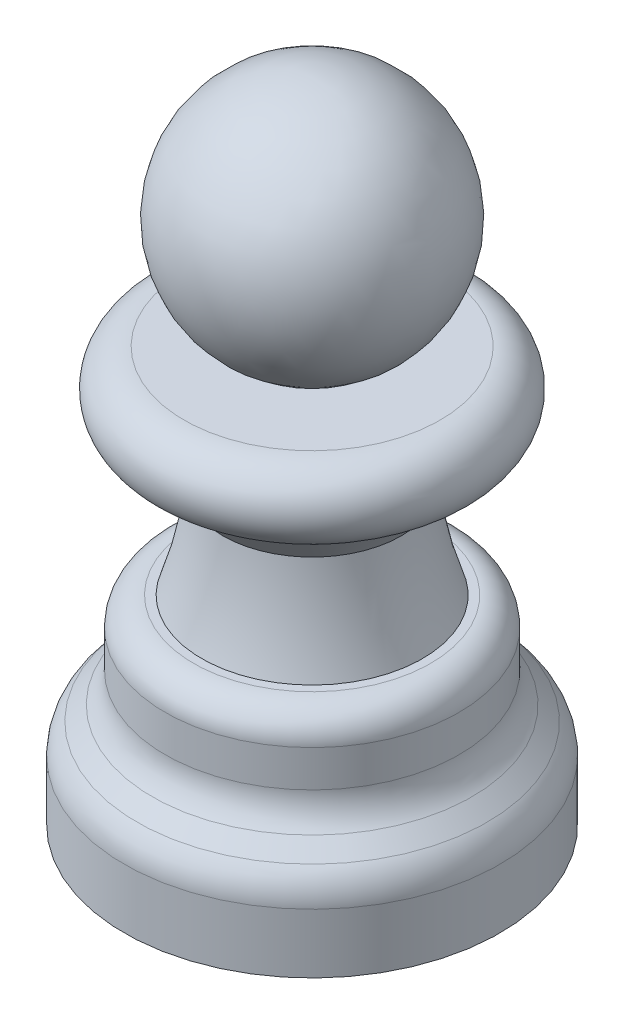
ISO-10303-21;
HEADER;
FILE_DESCRIPTION(('STEP AP214'),'2;1');
FILE_NAME('part.step','',(''),(''),'','','');
FILE_SCHEMA(('AUTOMOTIVE_DESIGN { 1 0 10303 214 1 1 1 1 }'));
ENDSEC;
DATA;
#1=APPLICATION_CONTEXT('core data for automotive mechanical design processes');
#2=APPLICATION_PROTOCOL_DEFINITION('international standard','automotive_design',2000,#1);
#3=PRODUCT_CONTEXT('',#1,'mechanical');
#4=PRODUCT('Part','Part','',(#3));
#5=PRODUCT_RELATED_PRODUCT_CATEGORY('part','',(#4));
#6=PRODUCT_DEFINITION_FORMATION('','',#4);
#7=PRODUCT_DEFINITION_CONTEXT('part definition',#1,'design');
#8=PRODUCT_DEFINITION('design','',#6,#7);
#9=PRODUCT_DEFINITION_SHAPE('','',#8);
#10=(LENGTH_UNIT() NAMED_UNIT(*) SI_UNIT(.MILLI.,.METRE.));
#11=(NAMED_UNIT(*) PLANE_ANGLE_UNIT() SI_UNIT($,.RADIAN.));
#12=(NAMED_UNIT(*) SI_UNIT($,.STERADIAN.) SOLID_ANGLE_UNIT());
#13=UNCERTAINTY_MEASURE_WITH_UNIT(LENGTH_MEASURE(1.E-05),#10,'distance_accuracy_value','');
#14=(GEOMETRIC_REPRESENTATION_CONTEXT(3) GLOBAL_UNCERTAINTY_ASSIGNED_CONTEXT((#13)) GLOBAL_UNIT_ASSIGNED_CONTEXT((#10,
#11,#12)) REPRESENTATION_CONTEXT('',''));
#15=CARTESIAN_POINT('',(0.,0.,0.));
#16=DIRECTION('',(0.,0.,1.));
#17=DIRECTION('',(1.,0.,0.));
#18=AXIS2_PLACEMENT_3D('',#15,#16,#17);
#19=CARTESIAN_POINT('',(0.,34.6588955443455,0.));
#20=DIRECTION('',(0.,-1.,0.));
#21=DIRECTION('',(0.,0.,-1.));
#22=AXIS2_PLACEMENT_3D('',#19,#20,#21);
#23=TOROIDAL_SURFACE('',#22,30.8078538333449,25.4);
#24=CARTESIAN_POINT('',(0.,32.2474807752198,0.));
#25=DIRECTION('',(0.,1.,0.));
#26=DIRECTION('',(0.,0.,1.));
#27=AXIS2_PLACEMENT_3D('',#24,#25,#26);
#28=CIRCLE('',#27,5.52257988167018);
#29=CARTESIAN_POINT('',(0.,32.2474807752198,5.52257988167018));
#30=VERTEX_POINT('',#29);
#31=EDGE_CURVE('E55',#30,#30,#28,.F.);
#32=ORIENTED_EDGE('',*,*,#31,.T.);
#33=EDGE_LOOP('',(#32));
#34=FACE_BOUND('',#33,.T.);
#35=CARTESIAN_POINT('',(0.,26.3191461497147,0.));
#36=DIRECTION('',(0.,-1.,0.));
#37=DIRECTION('',(0.,0.,-1.));
#38=AXIS2_PLACEMENT_3D('',#35,#36,#37);
#39=CIRCLE('',#38,6.81600980178382);
#40=CARTESIAN_POINT('',(0.,26.3191461497147,-6.81600980178382));
#41=VERTEX_POINT('',#40);
#42=EDGE_CURVE('E60',#41,#41,#39,.T.);
#43=ORIENTED_EDGE('',*,*,#42,.F.);
#44=EDGE_LOOP('',(#43));
#45=FACE_BOUND('',#44,.T.);
#46=ADVANCED_FACE('F46',(#34,#45),#23,.F.);
#47=CARTESIAN_POINT('',(-7.32281480130766,26.3191461497147,0.));
#48=DIRECTION('',(0.,-1.,0.));
#49=DIRECTION('',(0.,0.,-1.));
#50=AXIS2_PLACEMENT_3D('',#47,#48,#49);
#51=PLANE('',#50);
#52=CARTESIAN_POINT('',(0.,26.3191461497147,0.));
#53=DIRECTION('',(0.,-1.,0.));
#54=DIRECTION('',(0.,0.,-1.));
#55=AXIS2_PLACEMENT_3D('',#52,#53,#54);
#56=CIRCLE('',#55,7.32281480130766);
#57=CARTESIAN_POINT('',(0.,26.3191461497147,-7.32281480130766));
#58=VERTEX_POINT('',#57);
#59=EDGE_CURVE('E65',#58,#58,#56,.T.);
#60=ORIENTED_EDGE('',*,*,#59,.F.);
#61=EDGE_LOOP('',(#60));
#62=FACE_BOUND('',#61,.T.);
#63=ORIENTED_EDGE('',*,*,#42,.T.);
#64=EDGE_LOOP('',(#63));
#65=FACE_BOUND('',#64,.T.);
#66=ADVANCED_FACE('F168',(#62,#65),#51,.F.);
#67=CARTESIAN_POINT('',(0.,24.5685654289292,0.));
#68=DIRECTION('',(0.,-1.,0.));
#69=DIRECTION('',(0.,0.,-1.));
#70=AXIS2_PLACEMENT_3D('',#67,#68,#69);
#71=TOROIDAL_SURFACE('',#70,7.32281480130766,1.75058072078546);
#72=CARTESIAN_POINT('',(0.,24.5685654289292,0.));
#73=DIRECTION('',(0.,-1.,0.));
#74=DIRECTION('',(0.,0.,-1.));
#75=AXIS2_PLACEMENT_3D('',#72,#73,#74);
#76=CIRCLE('',#75,9.07339552209312);
#77=CARTESIAN_POINT('',(0.,24.5685654289292,-9.07339552209312));
#78=VERTEX_POINT('',#77);
#79=EDGE_CURVE('E71',#78,#78,#76,.T.);
#80=ORIENTED_EDGE('',*,*,#79,.F.);
#81=EDGE_LOOP('',(#80));
#82=FACE_BOUND('',#81,.T.);
#83=ORIENTED_EDGE('',*,*,#59,.T.);
#84=EDGE_LOOP('',(#83));
#85=FACE_BOUND('',#84,.T.);
#86=ADVANCED_FACE('F164',(#82,#85),#71,.T.);
#87=CARTESIAN_POINT('',(0.,-5.76149239932082,0.));
#88=DIRECTION('',(0.,-1.,0.));
#89=DIRECTION('',(0.,0.,-1.));
#90=AXIS2_PLACEMENT_3D('',#87,#88,#89);
#91=CYLINDRICAL_SURFACE('',#90,9.07339552209312);
#92=CARTESIAN_POINT('',(0.,22.3042849226797,0.));
#93=DIRECTION('',(0.,-1.,0.));
#94=DIRECTION('',(0.,0.,-1.));
#95=AXIS2_PLACEMENT_3D('',#92,#93,#94);
#96=CIRCLE('',#95,9.07339552209312);
#97=CARTESIAN_POINT('',(0.,22.3042849226797,-9.07339552209312));
#98=VERTEX_POINT('',#97);
#99=EDGE_CURVE('E75',#98,#98,#96,.T.);
#100=ORIENTED_EDGE('',*,*,#99,.F.);
#101=EDGE_LOOP('',(#100));
#102=FACE_BOUND('',#101,.T.);
#103=ORIENTED_EDGE('',*,*,#79,.T.);
#104=EDGE_LOOP('',(#103));
#105=FACE_BOUND('',#104,.T.);
#106=ADVANCED_FACE('F160',(#102,#105),#91,.T.);
#107=CARTESIAN_POINT('',(0.,22.3042849226797,0.));
#108=DIRECTION('',(0.,-1.,0.));
#109=DIRECTION('',(0.,0.,-1.));
#110=AXIS2_PLACEMENT_3D('',#107,#108,#109);
#111=TOROIDAL_SURFACE('',#110,11.6295833801063,2.55618785801321);
#112=CARTESIAN_POINT('',(0.,20.4521692336342,0.));
#113=DIRECTION('',(0.,-1.,0.));
#114=DIRECTION('',(0.,0.,-1.));
#115=AXIS2_PLACEMENT_3D('',#112,#113,#114);
#116=CIRCLE('',#115,9.86783315948883);
#117=CARTESIAN_POINT('',(0.,20.4521692336342,-9.86783315948883));
#118=VERTEX_POINT('',#117);
#119=EDGE_CURVE('E79',#118,#118,#116,.T.);
#120=ORIENTED_EDGE('',*,*,#119,.F.);
#121=EDGE_LOOP('',(#120));
#122=FACE_BOUND('',#121,.T.);
#123=ORIENTED_EDGE('',*,*,#99,.T.);
#124=EDGE_LOOP('',(#123));
#125=FACE_BOUND('',#124,.T.);
#126=ADVANCED_FACE('F156',(#122,#125),#111,.F.);
#127=CARTESIAN_POINT('',(0.,20.4521692336342,0.));
#128=DIRECTION('',(0.,-1.,0.));
#129=DIRECTION('',(0.,0.,-1.));
#130=AXIS2_PLACEMENT_3D('',#127,#128,#129);
#131=CONICAL_SURFACE('',#130,9.86783315948883,0.810398161672227);
#132=CARTESIAN_POINT('',(0.,19.5601922150067,0.));
#133=DIRECTION('',(0.,-1.,0.));
#134=DIRECTION('',(0.,0.,-1.));
#135=AXIS2_PLACEMENT_3D('',#132,#133,#134);
#136=CIRCLE('',#135,10.8055623626043);
#137=CARTESIAN_POINT('',(0.,19.5601922150067,-10.8055623626043));
#138=VERTEX_POINT('',#137);
#139=EDGE_CURVE('E83',#138,#138,#136,.T.);
#140=ORIENTED_EDGE('',*,*,#139,.F.);
#141=EDGE_LOOP('',(#140));
#142=FACE_BOUND('',#141,.T.);
#143=ORIENTED_EDGE('',*,*,#119,.T.);
#144=EDGE_LOOP('',(#143));
#145=FACE_BOUND('',#144,.T.);
#146=ADVANCED_FACE('F152',(#142,#145),#131,.T.);
#147=CARTESIAN_POINT('',(0.,17.7080765259612,0.));
#148=DIRECTION('',(0.,-1.,0.));
#149=DIRECTION('',(0.,0.,-1.));
#150=AXIS2_PLACEMENT_3D('',#147,#148,#149);
#151=TOROIDAL_SURFACE('',#150,9.04381214198678,2.55618785801322);
#152=CARTESIAN_POINT('',(0.,17.7080765259612,0.));
#153=DIRECTION('',(0.,-1.,0.));
#154=DIRECTION('',(0.,0.,-1.));
#155=AXIS2_PLACEMENT_3D('',#152,#153,#154);
#156=CIRCLE('',#155,11.6);
#157=CARTESIAN_POINT('',(0.,17.7080765259612,-11.6));
#158=VERTEX_POINT('',#157);
#159=EDGE_CURVE('E87',#158,#158,#156,.T.);
#160=ORIENTED_EDGE('',*,*,#159,.F.);
#161=EDGE_LOOP('',(#160));
#162=FACE_BOUND('',#161,.T.);
#163=ORIENTED_EDGE('',*,*,#139,.T.);
#164=EDGE_LOOP('',(#163));
#165=FACE_BOUND('',#164,.T.);
#166=ADVANCED_FACE('F148',(#162,#165),#151,.T.);
#167=CARTESIAN_POINT('',(0.,-5.76149239932082,0.));
#168=DIRECTION('',(0.,-1.,0.));
#169=DIRECTION('',(0.,0.,-1.));
#170=AXIS2_PLACEMENT_3D('',#167,#168,#169);
#171=CYLINDRICAL_SURFACE('',#170,11.6);
#172=CARTESIAN_POINT('',(0.,14.0338324378117,0.));
#173=DIRECTION('',(0.,-1.,0.));
#174=DIRECTION('',(0.,0.,-1.));
#175=AXIS2_PLACEMENT_3D('',#172,#173,#174);
#176=CIRCLE('',#175,11.6);
#177=CARTESIAN_POINT('',(0.,14.0338324378117,-11.6));
#178=VERTEX_POINT('',#177);
#179=EDGE_CURVE('E91',#178,#178,#176,.T.);
#180=ORIENTED_EDGE('',*,*,#179,.F.);
#181=EDGE_LOOP('',(#180));
#182=FACE_BOUND('',#181,.T.);
#183=ORIENTED_EDGE('',*,*,#159,.T.);
#184=EDGE_LOOP('',(#183));
#185=FACE_BOUND('',#184,.T.);
#186=ADVANCED_FACE('F144',(#182,#185),#171,.T.);
#187=CARTESIAN_POINT('',(-9.04381214198678,14.0338324378117,0.));
#188=DIRECTION('',(0.,1.,0.));
#189=DIRECTION('',(0.,0.,1.));
#190=AXIS2_PLACEMENT_3D('',#187,#188,#189);
#191=PLANE('',#190);
#192=ORIENTED_EDGE('',*,*,#179,.T.);
#193=EDGE_LOOP('',(#192));
#194=FACE_BOUND('',#193,.T.);
#195=ADVANCED_FACE('F140',(#194),#191,.F.);
#196=CARTESIAN_POINT('',(0.,46.5338324378117,0.));
#197=DIRECTION('',(0.,-1.,0.));
#198=DIRECTION('',(1.,0.,0.));
#199=AXIS2_PLACEMENT_3D('',#196,#197,#198);
#200=SPHERICAL_SURFACE('',#199,7.5);
#201=CARTESIAN_POINT('',(0.,39.6242818924262,0.));
#202=DIRECTION('',(0.,-1.,0.));
#203=DIRECTION('',(0.,0.,-1.));
#204=AXIS2_PLACEMENT_3D('',#201,#202,#203);
#205=CIRCLE('',#204,2.91686668546274);
#206=CARTESIAN_POINT('',(0.,39.6242818924262,-2.91686668546274));
#207=VERTEX_POINT('',#206);
#208=EDGE_CURVE('E95',#207,#207,#205,.T.);
#209=ORIENTED_EDGE('',*,*,#208,.F.);
#210=EDGE_LOOP('',(#209));
#211=FACE_BOUND('',#210,.T.);
#212=ADVANCED_FACE('F136',(#211),#200,.T.);
#213=CARTESIAN_POINT('',(-7.90829712707597,39.6242818924262,0.));
#214=DIRECTION('',(0.,-1.,0.));
#215=DIRECTION('',(0.,0.,-1.));
#216=AXIS2_PLACEMENT_3D('',#213,#214,#215);
#217=PLANE('',#216);
#218=CARTESIAN_POINT('',(0.,39.6242818924262,0.));
#219=DIRECTION('',(0.,-1.,0.));
#220=DIRECTION('',(0.,0.,-1.));
#221=AXIS2_PLACEMENT_3D('',#218,#219,#220);
#222=CIRCLE('',#221,7.90829712707597);
#223=CARTESIAN_POINT('',(0.,39.6242818924262,-7.90829712707597));
#224=VERTEX_POINT('',#223);
#225=EDGE_CURVE('E99',#224,#224,#222,.T.);
#226=ORIENTED_EDGE('',*,*,#225,.F.);
#227=EDGE_LOOP('',(#226));
#228=FACE_BOUND('',#227,.T.);
#229=ORIENTED_EDGE('',*,*,#208,.T.);
#230=EDGE_LOOP('',(#229));
#231=FACE_BOUND('',#230,.T.);
#232=ADVANCED_FACE('F133',(#228,#231),#217,.F.);
#233=CARTESIAN_POINT('',(0.,37.3742818924262,0.));
#234=DIRECTION('',(0.,-1.,0.));
#235=DIRECTION('',(0.,0.,-1.));
#236=AXIS2_PLACEMENT_3D('',#233,#234,#235);
#237=TOROIDAL_SURFACE('',#236,7.90829712707597,2.25);
#238=CARTESIAN_POINT('',(0.,35.1259925073173,0.));
#239=DIRECTION('',(0.,1.,0.));
#240=DIRECTION('',(0.,0.,1.));
#241=AXIS2_PLACEMENT_3D('',#238,#239,#240);
#242=CIRCLE('',#241,7.99601736880785);
#243=CARTESIAN_POINT('',(0.,35.1259925073173,7.99601736880785));
#244=VERTEX_POINT('',#243);
#245=EDGE_CURVE('E10',#244,#244,#242,.T.);
#246=ORIENTED_EDGE('',*,*,#245,.T.);
#247=EDGE_LOOP('',(#246));
#248=FACE_BOUND('',#247,.T.);
#249=ORIENTED_EDGE('',*,*,#225,.T.);
#250=EDGE_LOOP('',(#249));
#251=FACE_BOUND('',#250,.T.);
#252=ADVANCED_FACE('F130',(#248,#251),#237,.T.);
#253=CARTESIAN_POINT('',(0.,32.2474807752198,0.));
#254=DIRECTION('',(0.,1.,0.));
#255=DIRECTION('',(0.,0.,1.));
#256=AXIS2_PLACEMENT_3D('',#253,#254,#255);
#257=CONICAL_SURFACE('',#256,5.52257988167022,0.709854958647927);
#258=ORIENTED_EDGE('',*,*,#245,.F.);
#259=EDGE_LOOP('',(#258));
#260=FACE_BOUND('',#259,.T.);
#261=ORIENTED_EDGE('',*,*,#31,.F.);
#262=EDGE_LOOP('',(#261));
#263=FACE_BOUND('',#262,.T.);
#264=ADVANCED_FACE('F49',(#260,#263),#257,.T.);
#265=CLOSED_SHELL('',(#46,#66,#86,#106,#126,#146,#166,#186,#195,#212,#232,#252,#264));
#266=CARTESIAN_POINT('',(0.,16.9938324378117,0.));
#267=DIRECTION('',(0.,-1.,0.));
#268=DIRECTION('',(0.,0.,-1.));
#269=AXIS2_PLACEMENT_3D('',#266,#267,#268);
#270=CYLINDRICAL_SURFACE('',#269,10.);
#271=CARTESIAN_POINT('',(0.,16.9938324378117,0.));
#272=DIRECTION('',(0.,-1.,0.));
#273=DIRECTION('',(0.,0.,-1.));
#274=AXIS2_PLACEMENT_3D('',#271,#272,#273);
#275=CIRCLE('',#274,10.);
#276=CARTESIAN_POINT('',(0.,16.9938324378117,-10.));
#277=VERTEX_POINT('',#276);
#278=EDGE_CURVE('E103',#277,#277,#275,.T.);
#279=CARTESIAN_POINT('',(0.,14.4338324378117,0.));
#280=DIRECTION('',(0.,-1.,0.));
#281=DIRECTION('',(0.,0.,-1.));
#282=AXIS2_PLACEMENT_3D('',#279,#280,#281);
#283=CIRCLE('',#282,10.);
#284=CARTESIAN_POINT('',(0.,14.4338324378117,-10.));
#285=VERTEX_POINT('',#284);
#286=EDGE_CURVE('E104',#285,#285,#283,.T.);
#287=CARTESIAN_POINT('',(0.,16.9938324378117,-10.));
#288=CARTESIAN_POINT('',(0.,16.967165771145,-10.));
#289=CARTESIAN_POINT('',(0.,16.9404991044784,-10.));
#290=CARTESIAN_POINT('',(0.,16.887165771145,-10.));
#291=CARTESIAN_POINT('',(0.,16.8604991044784,-10.));
#292=CARTESIAN_POINT('',(0.,16.807165771145,-10.));
#293=CARTESIAN_POINT('',(0.,16.7804991044784,-10.));
#294=CARTESIAN_POINT('',(0.,16.727165771145,-10.));
#295=CARTESIAN_POINT('',(0.,16.7004991044784,-10.));
#296=CARTESIAN_POINT('',(0.,16.647165771145,-10.));
#297=CARTESIAN_POINT('',(0.,16.6204991044784,-10.));
#298=CARTESIAN_POINT('',(0.,16.567165771145,-10.));
#299=CARTESIAN_POINT('',(0.,16.5404991044784,-10.));
#300=CARTESIAN_POINT('',(0.,16.487165771145,-10.));
#301=CARTESIAN_POINT('',(0.,16.4604991044784,-10.));
#302=CARTESIAN_POINT('',(0.,16.407165771145,-10.));
#303=CARTESIAN_POINT('',(0.,16.3804991044784,-10.));
#304=CARTESIAN_POINT('',(0.,16.327165771145,-10.));
#305=CARTESIAN_POINT('',(0.,16.3004991044784,-10.));
#306=CARTESIAN_POINT('',(0.,16.247165771145,-10.));
#307=CARTESIAN_POINT('',(0.,16.2204991044784,-10.));
#308=CARTESIAN_POINT('',(0.,16.167165771145,-10.));
#309=CARTESIAN_POINT('',(0.,16.1404991044784,-10.));
#310=CARTESIAN_POINT('',(0.,16.087165771145,-10.));
#311=CARTESIAN_POINT('',(0.,16.0604991044784,-10.));
#312=CARTESIAN_POINT('',(0.,16.007165771145,-10.));
#313=CARTESIAN_POINT('',(0.,15.9804991044784,-10.));
#314=CARTESIAN_POINT('',(0.,15.927165771145,-10.));
#315=CARTESIAN_POINT('',(0.,15.9004991044784,-10.));
#316=CARTESIAN_POINT('',(0.,15.847165771145,-10.));
#317=CARTESIAN_POINT('',(0.,15.8204991044784,-10.));
#318=CARTESIAN_POINT('',(0.,15.767165771145,-10.));
#319=CARTESIAN_POINT('',(0.,15.7404991044784,-10.));
#320=CARTESIAN_POINT('',(0.,15.687165771145,-10.));
#321=CARTESIAN_POINT('',(0.,15.6604991044784,-10.));
#322=CARTESIAN_POINT('',(0.,15.607165771145,-10.));
#323=CARTESIAN_POINT('',(0.,15.5804991044784,-10.));
#324=CARTESIAN_POINT('',(0.,15.527165771145,-10.));
#325=CARTESIAN_POINT('',(0.,15.5004991044784,-10.));
#326=CARTESIAN_POINT('',(0.,15.447165771145,-10.));
#327=CARTESIAN_POINT('',(0.,15.4204991044784,-10.));
#328=CARTESIAN_POINT('',(0.,15.367165771145,-10.));
#329=CARTESIAN_POINT('',(0.,15.3404991044784,-10.));
#330=CARTESIAN_POINT('',(0.,15.287165771145,-10.));
#331=CARTESIAN_POINT('',(0.,15.2604991044784,-10.));
#332=CARTESIAN_POINT('',(0.,15.207165771145,-10.));
#333=CARTESIAN_POINT('',(0.,15.1804991044784,-10.));
#334=CARTESIAN_POINT('',(0.,15.127165771145,-10.));
#335=CARTESIAN_POINT('',(0.,15.1004991044784,-10.));
#336=CARTESIAN_POINT('',(0.,15.047165771145,-10.));
#337=CARTESIAN_POINT('',(0.,15.0204991044784,-10.));
#338=CARTESIAN_POINT('',(0.,14.967165771145,-10.));
#339=CARTESIAN_POINT('',(0.,14.9404991044784,-10.));
#340=CARTESIAN_POINT('',(0.,14.887165771145,-10.));
#341=CARTESIAN_POINT('',(0.,14.8604991044784,-10.));
#342=CARTESIAN_POINT('',(0.,14.807165771145,-10.));
#343=CARTESIAN_POINT('',(0.,14.7804991044784,-10.));
#344=CARTESIAN_POINT('',(0.,14.727165771145,-10.));
#345=CARTESIAN_POINT('',(0.,14.7004991044784,-10.));
#346=CARTESIAN_POINT('',(0.,14.647165771145,-10.));
#347=CARTESIAN_POINT('',(0.,14.6204991044784,-10.));
#348=CARTESIAN_POINT('',(0.,14.567165771145,-10.));
#349=CARTESIAN_POINT('',(0.,14.5404991044784,-10.));
#350=CARTESIAN_POINT('',(0.,14.487165771145,-10.));
#351=CARTESIAN_POINT('',(0.,14.4604991044784,-10.));
#352=CARTESIAN_POINT('',(0.,14.4338324378117,-10.));
#353=B_SPLINE_CURVE_WITH_KNOTS('',3,(#287,#288,#289,#290,#291,#292,#293,#294,#295,#296,#297,
#298,#299,#300,#301,#302,#303,#304,#305,#306,#307,#308,#309,#310,#311,#312,#313,#314,#315,#316,
#317,#318,#319,#320,#321,#322,#323,#324,#325,#326,#327,#328,#329,#330,#331,#332,#333,#334,#335,
#336,#337,#338,#339,#340,#341,#342,#343,#344,#345,#346,#347,#348,#349,#350,#351,#352),
.UNSPECIFIED.,.F.,.F.,(4,2,2,2,2,2,2,2,2,2,2,2,2,2,2,2,2,2,2,2,2,2,2,2,2,2,2,2,2,2,2,2,4),(0.,
0.0800000000000002,0.16,0.240000000000001,0.320000000000001,0.400000000000001,0.480000000000001,
0.560000000000001,0.640000000000002,0.720000000000002,0.800000000000002,0.880000000000002,
0.960000000000003,1.04,1.12,1.2,1.28,1.36,1.44,1.52,1.6,1.68,1.76,1.84,1.92,2.,2.08,2.16,2.24,
2.32,2.4,2.48,2.56),.UNSPECIFIED.);
#354=EDGE_CURVE('BSEAM114',#277,#285,#353,.T.);
#355=ORIENTED_EDGE('',*,*,#278,.F.);
#356=ORIENTED_EDGE('',*,*,#286,.T.);
#357=ORIENTED_EDGE('',*,*,#354,.T.);
#358=ORIENTED_EDGE('',*,*,#354,.F.);
#359=EDGE_LOOP('',(#355,#357,#356,#358));
#360=FACE_BOUND('',#359,.T.);
#361=ADVANCED_FACE('F114',(#360),#270,.F.);
#362=CARTESIAN_POINT('',(0.,16.9938324378117,0.));
#363=DIRECTION('',(0.,-1.,0.));
#364=DIRECTION('',(0.,0.,-1.));
#365=AXIS2_PLACEMENT_3D('',#362,#363,#364);
#366=PLANE('',#365);
#367=ORIENTED_EDGE('',*,*,#278,.T.);
#368=EDGE_LOOP('',(#367));
#369=FACE_BOUND('',#368,.T.);
#370=ADVANCED_FACE('F112',(#369),#366,.T.);
#371=CARTESIAN_POINT('',(0.,14.4338324378117,0.));
#372=DIRECTION('',(0.,-1.,0.));
#373=DIRECTION('',(0.,0.,-1.));
#374=AXIS2_PLACEMENT_3D('',#371,#372,#373);
#375=PLANE('',#374);
#376=ORIENTED_EDGE('',*,*,#286,.F.);
#377=EDGE_LOOP('',(#376));
#378=FACE_BOUND('',#377,.T.);
#379=ADVANCED_FACE('F121',(#378),#375,.F.);
#380=CLOSED_SHELL('',(#361,#370,#379));
#381=ORIENTED_CLOSED_SHELL('',*,#380,.T.);
#382=BREP_WITH_VOIDS('B2',#265,(#381));
#383=ADVANCED_BREP_SHAPE_REPRESENTATION('',(#18,#382),#14);
#384=SHAPE_DEFINITION_REPRESENTATION(#9,#383);
ENDSEC;
END-ISO-10303-21;
